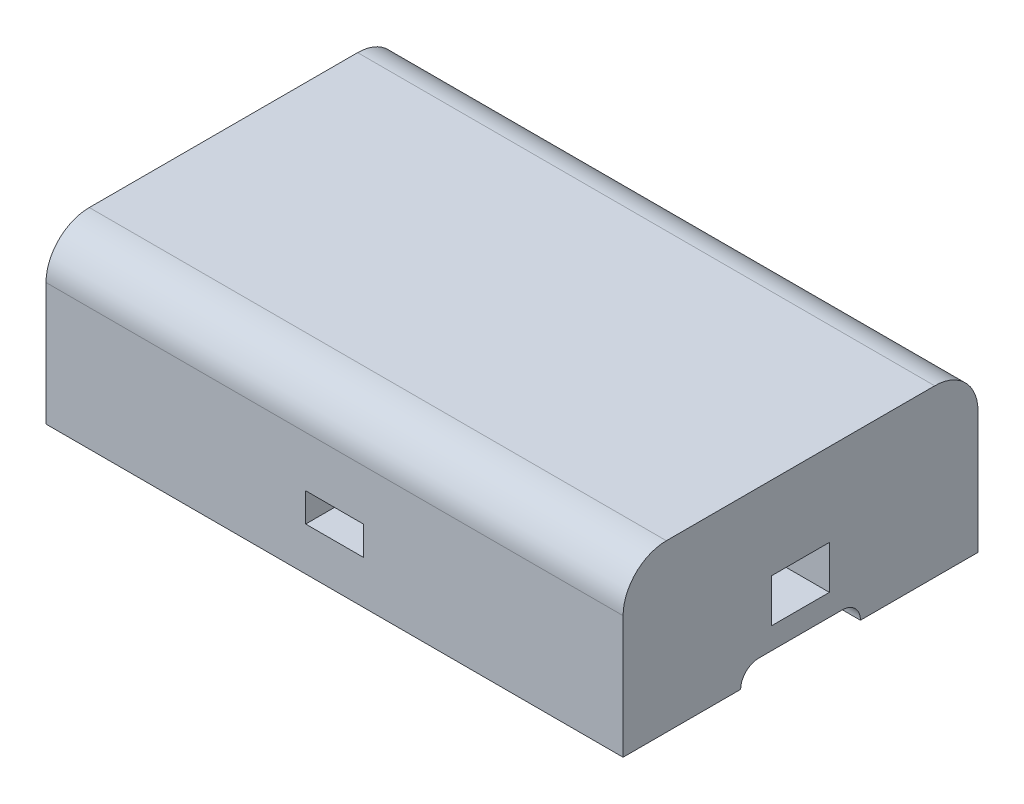
ISO-10303-21;
HEADER;
FILE_DESCRIPTION(('STEP AP214'),'2;1');
FILE_NAME('part.step','',(''),(''),'','','');
FILE_SCHEMA(('AUTOMOTIVE_DESIGN { 1 0 10303 214 1 1 1 1 }'));
ENDSEC;
DATA;
#1=APPLICATION_CONTEXT('core data for automotive mechanical design processes');
#2=APPLICATION_PROTOCOL_DEFINITION('international standard','automotive_design',2000,#1);
#3=PRODUCT_CONTEXT('',#1,'mechanical');
#4=PRODUCT('Part','Part','',(#3));
#5=PRODUCT_RELATED_PRODUCT_CATEGORY('part','',(#4));
#6=PRODUCT_DEFINITION_FORMATION('','',#4);
#7=PRODUCT_DEFINITION_CONTEXT('part definition',#1,'design');
#8=PRODUCT_DEFINITION('design','',#6,#7);
#9=PRODUCT_DEFINITION_SHAPE('','',#8);
#10=(LENGTH_UNIT() NAMED_UNIT(*) SI_UNIT(.MILLI.,.METRE.));
#11=(NAMED_UNIT(*) PLANE_ANGLE_UNIT() SI_UNIT($,.RADIAN.));
#12=(NAMED_UNIT(*) SI_UNIT($,.STERADIAN.) SOLID_ANGLE_UNIT());
#13=UNCERTAINTY_MEASURE_WITH_UNIT(LENGTH_MEASURE(1.E-05),#10,'distance_accuracy_value','');
#14=(GEOMETRIC_REPRESENTATION_CONTEXT(3) GLOBAL_UNCERTAINTY_ASSIGNED_CONTEXT((#13)) GLOBAL_UNIT_ASSIGNED_CONTEXT((#10,
#11,#12)) REPRESENTATION_CONTEXT('',''));
#15=CARTESIAN_POINT('',(0.,0.,0.));
#16=DIRECTION('',(0.,0.,1.));
#17=DIRECTION('',(1.,0.,0.));
#18=AXIS2_PLACEMENT_3D('',#15,#16,#17);
#19=CARTESIAN_POINT('',(-20.,14.,12.3));
#20=DIRECTION('',(0.,0.,-1.));
#21=DIRECTION('',(-1.,0.,0.));
#22=AXIS2_PLACEMENT_3D('',#19,#20,#21);
#23=PLANE('',#22);
#24=DIRECTION('',(0.,-1.,0.));
#25=VECTOR('',#24,1.);
#26=CARTESIAN_POINT('',(-20.,14.,12.3));
#27=LINE('',#26,#25);
#28=CARTESIAN_POINT('',(-20.,14.,12.3));
#29=VERTEX_POINT('',#28);
#30=CARTESIAN_POINT('',(-20.,5.5,12.3));
#31=VERTEX_POINT('',#30);
#32=EDGE_CURVE('E489',#29,#31,#27,.T.);
#33=ORIENTED_EDGE('',*,*,#32,.T.);
#34=DIRECTION('',(-1.,0.,0.));
#35=VECTOR('',#34,1.);
#36=CARTESIAN_POINT('',(-20.,5.5,12.3));
#37=LINE('',#36,#35);
#38=CARTESIAN_POINT('',(20.,5.5,12.3));
#39=VERTEX_POINT('',#38);
#40=EDGE_CURVE('E476',#39,#31,#37,.T.);
#41=ORIENTED_EDGE('',*,*,#40,.F.);
#42=DIRECTION('',(0.,-1.,0.));
#43=VECTOR('',#42,1.);
#44=CARTESIAN_POINT('',(20.,14.,12.3));
#45=LINE('',#44,#43);
#46=CARTESIAN_POINT('',(20.,14.,12.3));
#47=VERTEX_POINT('',#46);
#48=EDGE_CURVE('E426',#47,#39,#45,.T.);
#49=ORIENTED_EDGE('',*,*,#48,.F.);
#50=DIRECTION('',(1.,0.,0.));
#51=VECTOR('',#50,1.);
#52=CARTESIAN_POINT('',(-20.,14.,12.3));
#53=LINE('',#52,#51);
#54=EDGE_CURVE('E422',#29,#47,#53,.T.);
#55=ORIENTED_EDGE('',*,*,#54,.F.);
#56=EDGE_LOOP('',(#33,#41,#49,#55));
#57=FACE_BOUND('',#56,.T.);
#58=DIRECTION('',(-1.,0.,0.));
#59=VECTOR('',#58,1.);
#60=CARTESIAN_POINT('',(2.,8.5,12.3));
#61=LINE('',#60,#59);
#62=CARTESIAN_POINT('',(2.,8.5,12.3));
#63=VERTEX_POINT('',#62);
#64=CARTESIAN_POINT('',(-2.,8.5,12.3));
#65=VERTEX_POINT('',#64);
#66=EDGE_CURVE('E359',#63,#65,#61,.T.);
#67=ORIENTED_EDGE('',*,*,#66,.T.);
#68=DIRECTION('',(0.,-1.,0.));
#69=VECTOR('',#68,1.);
#70=CARTESIAN_POINT('',(-2.,14.,12.3));
#71=LINE('',#70,#69);
#72=CARTESIAN_POINT('',(-2.,10.5,12.3));
#73=VERTEX_POINT('',#72);
#74=EDGE_CURVE('E11',#73,#65,#71,.T.);
#75=ORIENTED_EDGE('',*,*,#74,.F.);
#76=DIRECTION('',(-1.,0.,0.));
#77=VECTOR('',#76,1.);
#78=CARTESIAN_POINT('',(-20.,10.5,12.3));
#79=LINE('',#78,#77);
#80=CARTESIAN_POINT('',(2.,10.5,12.3));
#81=VERTEX_POINT('',#80);
#82=EDGE_CURVE('E514',#81,#73,#79,.T.);
#83=ORIENTED_EDGE('',*,*,#82,.F.);
#84=DIRECTION('',(0.,1.,0.));
#85=VECTOR('',#84,1.);
#86=CARTESIAN_POINT('',(2.,14.,12.3));
#87=LINE('',#86,#85);
#88=EDGE_CURVE('E46',#63,#81,#87,.T.);
#89=ORIENTED_EDGE('',*,*,#88,.F.);
#90=EDGE_LOOP('',(#67,#75,#83,#89));
#91=FACE_BOUND('',#90,.T.);
#92=ADVANCED_FACE('F39',(#57,#91),#23,.F.);
#93=CARTESIAN_POINT('',(0.,5.5,0.));
#94=DIRECTION('',(0.,-1.,0.));
#95=DIRECTION('',(0.,0.,-1.));
#96=AXIS2_PLACEMENT_3D('',#93,#94,#95);
#97=PLANE('',#96);
#98=DIRECTION('',(0.,0.,-1.));
#99=VECTOR('',#98,1.);
#100=CARTESIAN_POINT('',(13.,5.5,-11.3));
#101=LINE('',#100,#99);
#102=CARTESIAN_POINT('',(13.,5.5,-11.3));
#103=VERTEX_POINT('',#102);
#104=CARTESIAN_POINT('',(13.,5.5,-12.3));
#105=VERTEX_POINT('',#104);
#106=EDGE_CURVE('E351',#103,#105,#101,.T.);
#107=ORIENTED_EDGE('',*,*,#106,.T.);
#108=DIRECTION('',(1.,0.,0.));
#109=VECTOR('',#108,1.);
#110=CARTESIAN_POINT('',(-20.,5.5,-12.3));
#111=LINE('',#110,#109);
#112=CARTESIAN_POINT('',(20.,5.5,-12.3));
#113=VERTEX_POINT('',#112);
#114=EDGE_CURVE('E472',#105,#113,#111,.T.);
#115=ORIENTED_EDGE('',*,*,#114,.T.);
#116=DIRECTION('',(0.,0.,1.));
#117=VECTOR('',#116,1.);
#118=CARTESIAN_POINT('',(20.,5.5,-12.3));
#119=LINE('',#118,#117);
#120=CARTESIAN_POINT('',(20.,5.5,-4.15));
#121=VERTEX_POINT('',#120);
#122=EDGE_CURVE('E464',#113,#121,#119,.T.);
#123=ORIENTED_EDGE('',*,*,#122,.T.);
#124=DIRECTION('',(1.,0.,0.));
#125=VECTOR('',#124,1.);
#126=CARTESIAN_POINT('',(10.,5.5,-4.15));
#127=LINE('',#126,#125);
#128=CARTESIAN_POINT('',(17.,5.5,-4.15));
#129=VERTEX_POINT('',#128);
#130=EDGE_CURVE('E478',#121,#129,#127,.F.);
#131=ORIENTED_EDGE('',*,*,#130,.T.);
#132=DIRECTION('',(0.,0.,1.));
#133=VECTOR('',#132,1.);
#134=CARTESIAN_POINT('',(17.,5.5,-9.3));
#135=LINE('',#134,#133);
#136=CARTESIAN_POINT('',(17.,5.5,-9.3));
#137=VERTEX_POINT('',#136);
#138=EDGE_CURVE('E461',#137,#129,#135,.T.);
#139=ORIENTED_EDGE('',*,*,#138,.F.);
#140=DIRECTION('',(1.,0.,0.));
#141=VECTOR('',#140,1.);
#142=CARTESIAN_POINT('',(-17.,5.5,-9.3));
#143=LINE('',#142,#141);
#144=CARTESIAN_POINT('',(-17.,5.5,-9.3));
#145=VERTEX_POINT('',#144);
#146=EDGE_CURVE('E458',#145,#137,#143,.T.);
#147=ORIENTED_EDGE('',*,*,#146,.F.);
#148=DIRECTION('',(0.,0.,-1.));
#149=VECTOR('',#148,1.);
#150=CARTESIAN_POINT('',(-17.,5.5,-9.3));
#151=LINE('',#150,#149);
#152=CARTESIAN_POINT('',(-17.,5.5,9.3));
#153=VERTEX_POINT('',#152);
#154=EDGE_CURVE('E456',#153,#145,#151,.T.);
#155=ORIENTED_EDGE('',*,*,#154,.F.);
#156=DIRECTION('',(-1.,0.,0.));
#157=VECTOR('',#156,1.);
#158=CARTESIAN_POINT('',(-17.,5.5,9.3));
#159=LINE('',#158,#157);
#160=CARTESIAN_POINT('',(17.,5.5,9.3));
#161=VERTEX_POINT('',#160);
#162=EDGE_CURVE('E453',#161,#153,#159,.T.);
#163=ORIENTED_EDGE('',*,*,#162,.F.);
#164=CARTESIAN_POINT('',(17.,5.5,4.15));
#165=VERTEX_POINT('',#164);
#166=EDGE_CURVE('E460',#165,#161,#135,.T.);
#167=ORIENTED_EDGE('',*,*,#166,.F.);
#168=DIRECTION('',(1.,0.,0.));
#169=VECTOR('',#168,1.);
#170=CARTESIAN_POINT('',(10.,5.5,4.15));
#171=LINE('',#170,#169);
#172=CARTESIAN_POINT('',(20.,5.5,4.15));
#173=VERTEX_POINT('',#172);
#174=EDGE_CURVE('E410',#165,#173,#171,.T.);
#175=ORIENTED_EDGE('',*,*,#174,.T.);
#176=EDGE_CURVE('E465',#173,#39,#119,.T.);
#177=ORIENTED_EDGE('',*,*,#176,.T.);
#178=ORIENTED_EDGE('',*,*,#40,.T.);
#179=DIRECTION('',(0.,0.,-1.));
#180=VECTOR('',#179,1.);
#181=CARTESIAN_POINT('',(-20.,5.5,-12.3));
#182=LINE('',#181,#180);
#183=CARTESIAN_POINT('',(-20.,5.5,-12.3));
#184=VERTEX_POINT('',#183);
#185=EDGE_CURVE('E473',#31,#184,#182,.T.);
#186=ORIENTED_EDGE('',*,*,#185,.T.);
#187=CARTESIAN_POINT('',(-13.,5.5,-12.3));
#188=VERTEX_POINT('',#187);
#189=EDGE_CURVE('E468',#184,#188,#111,.T.);
#190=ORIENTED_EDGE('',*,*,#189,.T.);
#191=DIRECTION('',(0.,0.,-1.));
#192=VECTOR('',#191,1.);
#193=CARTESIAN_POINT('',(-13.,5.5,-11.3));
#194=LINE('',#193,#192);
#195=CARTESIAN_POINT('',(-13.,5.5,-11.3));
#196=VERTEX_POINT('',#195);
#197=EDGE_CURVE('E327',#196,#188,#194,.T.);
#198=ORIENTED_EDGE('',*,*,#197,.F.);
#199=DIRECTION('',(-1.,0.,0.));
#200=VECTOR('',#199,1.);
#201=CARTESIAN_POINT('',(-13.,5.5,-11.3));
#202=LINE('',#201,#200);
#203=CARTESIAN_POINT('',(-11.,5.5,-11.3));
#204=VERTEX_POINT('',#203);
#205=EDGE_CURVE('E318',#204,#196,#202,.T.);
#206=ORIENTED_EDGE('',*,*,#205,.F.);
#207=DIRECTION('',(0.,0.,-1.));
#208=VECTOR('',#207,1.);
#209=CARTESIAN_POINT('',(-11.,5.5,-11.3));
#210=LINE('',#209,#208);
#211=CARTESIAN_POINT('',(-11.,5.5,-12.3));
#212=VERTEX_POINT('',#211);
#213=EDGE_CURVE('E333',#204,#212,#210,.T.);
#214=ORIENTED_EDGE('',*,*,#213,.T.);
#215=CARTESIAN_POINT('',(11.,5.5,-12.3));
#216=VERTEX_POINT('',#215);
#217=EDGE_CURVE('E471',#212,#216,#111,.T.);
#218=ORIENTED_EDGE('',*,*,#217,.T.);
#219=DIRECTION('',(0.,0.,-1.));
#220=VECTOR('',#219,1.);
#221=CARTESIAN_POINT('',(11.,5.5,-11.3));
#222=LINE('',#221,#220);
#223=CARTESIAN_POINT('',(11.,5.5,-11.3));
#224=VERTEX_POINT('',#223);
#225=EDGE_CURVE('E363',#224,#216,#222,.T.);
#226=ORIENTED_EDGE('',*,*,#225,.F.);
#227=DIRECTION('',(-1.,0.,0.));
#228=VECTOR('',#227,1.);
#229=CARTESIAN_POINT('',(13.,5.5,-11.3));
#230=LINE('',#229,#228);
#231=EDGE_CURVE('E344',#103,#224,#230,.T.);
#232=ORIENTED_EDGE('',*,*,#231,.F.);
#233=EDGE_LOOP('',(#107,#115,#123,#131,#139,#147,#155,#163,#167,#175,#177,#178,#186,#190,#198,
#206,#214,#218,#226,#232));
#234=FACE_BOUND('',#233,.T.);
#235=ADVANCED_FACE('F551',(#234),#97,.T.);
#236=CARTESIAN_POINT('',(20.,14.,-12.3));
#237=DIRECTION('',(-1.,0.,0.));
#238=DIRECTION('',(0.,0.,1.));
#239=AXIS2_PLACEMENT_3D('',#236,#237,#238);
#240=PLANE('',#239);
#241=DIRECTION('',(0.,0.,1.));
#242=VECTOR('',#241,1.);
#243=CARTESIAN_POINT('',(20.,11.25,2.));
#244=LINE('',#243,#242);
#245=CARTESIAN_POINT('',(20.,11.25,-2.));
#246=VERTEX_POINT('',#245);
#247=CARTESIAN_POINT('',(20.,11.25,2.));
#248=VERTEX_POINT('',#247);
#249=EDGE_CURVE('E398',#246,#248,#244,.T.);
#250=ORIENTED_EDGE('',*,*,#249,.F.);
#251=DIRECTION('',(0.,1.,0.));
#252=VECTOR('',#251,1.);
#253=CARTESIAN_POINT('',(20.,11.25,-2.));
#254=LINE('',#253,#252);
#255=CARTESIAN_POINT('',(20.,8.25,-2.));
#256=VERTEX_POINT('',#255);
#257=EDGE_CURVE('E396',#256,#246,#254,.T.);
#258=ORIENTED_EDGE('',*,*,#257,.F.);
#259=DIRECTION('',(0.,0.,-1.));
#260=VECTOR('',#259,1.);
#261=CARTESIAN_POINT('',(20.,8.25,2.));
#262=LINE('',#261,#260);
#263=CARTESIAN_POINT('',(20.,8.25,2.));
#264=VERTEX_POINT('',#263);
#265=EDGE_CURVE('E404',#264,#256,#262,.T.);
#266=ORIENTED_EDGE('',*,*,#265,.F.);
#267=DIRECTION('',(0.,-1.,0.));
#268=VECTOR('',#267,1.);
#269=CARTESIAN_POINT('',(20.,11.25,2.));
#270=LINE('',#269,#268);
#271=EDGE_CURVE('E401',#248,#264,#270,.T.);
#272=ORIENTED_EDGE('',*,*,#271,.F.);
#273=EDGE_LOOP('',(#250,#258,#266,#272));
#274=FACE_BOUND('',#273,.T.);
#275=ORIENTED_EDGE('',*,*,#122,.F.);
#276=DIRECTION('',(0.,-1.,0.));
#277=VECTOR('',#276,1.);
#278=CARTESIAN_POINT('',(20.,14.,-12.3));
#279=LINE('',#278,#277);
#280=CARTESIAN_POINT('',(20.,14.,-12.3));
#281=VERTEX_POINT('',#280);
#282=EDGE_CURVE('E420',#281,#113,#279,.T.);
#283=ORIENTED_EDGE('',*,*,#282,.F.);
#284=CARTESIAN_POINT('',(20.,14.,-9.3));
#285=DIRECTION('',(1.,0.,0.));
#286=DIRECTION('',(0.,0.,-1.));
#287=AXIS2_PLACEMENT_3D('',#284,#285,#286);
#288=CIRCLE('',#287,3.);
#289=CARTESIAN_POINT('',(20.,17.,-9.3));
#290=VERTEX_POINT('',#289);
#291=EDGE_CURVE('E379',#281,#290,#288,.T.);
#292=ORIENTED_EDGE('',*,*,#291,.T.);
#293=DIRECTION('',(0.,0.,-1.));
#294=VECTOR('',#293,1.);
#295=CARTESIAN_POINT('',(20.,17.,9.3));
#296=LINE('',#295,#294);
#297=CARTESIAN_POINT('',(20.,17.,9.3));
#298=VERTEX_POINT('',#297);
#299=EDGE_CURVE('E387',#298,#290,#296,.T.);
#300=ORIENTED_EDGE('',*,*,#299,.F.);
#301=CARTESIAN_POINT('',(20.,14.,9.3));
#302=DIRECTION('',(-1.,0.,0.));
#303=DIRECTION('',(0.,0.,1.));
#304=AXIS2_PLACEMENT_3D('',#301,#302,#303);
#305=CIRCLE('',#304,3.);
#306=EDGE_CURVE('E374',#47,#298,#305,.T.);
#307=ORIENTED_EDGE('',*,*,#306,.F.);
#308=ORIENTED_EDGE('',*,*,#48,.T.);
#309=ORIENTED_EDGE('',*,*,#176,.F.);
#310=CARTESIAN_POINT('',(20.,5.5,2.9));
#311=DIRECTION('',(1.,0.,0.));
#312=DIRECTION('',(0.,0.,-1.));
#313=AXIS2_PLACEMENT_3D('',#310,#311,#312);
#314=CIRCLE('',#313,1.25);
#315=CARTESIAN_POINT('',(20.,6.75,2.9));
#316=VERTEX_POINT('',#315);
#317=EDGE_CURVE('E447',#316,#173,#314,.T.);
#318=ORIENTED_EDGE('',*,*,#317,.F.);
#319=DIRECTION('',(0.,0.,-1.));
#320=VECTOR('',#319,1.);
#321=CARTESIAN_POINT('',(20.,6.75,0.));
#322=LINE('',#321,#320);
#323=CARTESIAN_POINT('',(20.,6.75,-2.9));
#324=VERTEX_POINT('',#323);
#325=EDGE_CURVE('E449',#316,#324,#322,.T.);
#326=ORIENTED_EDGE('',*,*,#325,.T.);
#327=CARTESIAN_POINT('',(20.,5.5,-2.9));
#328=DIRECTION('',(1.,0.,0.));
#329=DIRECTION('',(0.,0.,-1.));
#330=AXIS2_PLACEMENT_3D('',#327,#328,#329);
#331=CIRCLE('',#330,1.25);
#332=EDGE_CURVE('E452',#121,#324,#331,.T.);
#333=ORIENTED_EDGE('',*,*,#332,.F.);
#334=EDGE_LOOP('',(#275,#283,#292,#300,#307,#308,#309,#318,#326,#333));
#335=FACE_BOUND('',#334,.T.);
#336=ADVANCED_FACE('F553',(#274,#335),#240,.F.);
#337=CARTESIAN_POINT('',(-20.,14.,-12.3));
#338=DIRECTION('',(0.,0.,1.));
#339=DIRECTION('',(1.,0.,0.));
#340=AXIS2_PLACEMENT_3D('',#337,#338,#339);
#341=PLANE('',#340);
#342=ORIENTED_EDGE('',*,*,#114,.F.);
#343=DIRECTION('',(0.,-1.,0.));
#344=VECTOR('',#343,1.);
#345=CARTESIAN_POINT('',(13.,5.5,-12.3));
#346=LINE('',#345,#344);
#347=CARTESIAN_POINT('',(13.,8.5,-12.3));
#348=VERTEX_POINT('',#347);
#349=EDGE_CURVE('E336',#348,#105,#346,.T.);
#350=ORIENTED_EDGE('',*,*,#349,.F.);
#351=DIRECTION('',(1.,0.,0.));
#352=VECTOR('',#351,1.);
#353=CARTESIAN_POINT('',(13.,8.5,-12.3));
#354=LINE('',#353,#352);
#355=CARTESIAN_POINT('',(11.,8.5,-12.3));
#356=VERTEX_POINT('',#355);
#357=EDGE_CURVE('E345',#356,#348,#354,.T.);
#358=ORIENTED_EDGE('',*,*,#357,.F.);
#359=DIRECTION('',(0.,1.,0.));
#360=VECTOR('',#359,1.);
#361=CARTESIAN_POINT('',(11.,5.5,-12.3));
#362=LINE('',#361,#360);
#363=EDGE_CURVE('E353',#216,#356,#362,.T.);
#364=ORIENTED_EDGE('',*,*,#363,.F.);
#365=ORIENTED_EDGE('',*,*,#217,.F.);
#366=DIRECTION('',(0.,-1.,0.));
#367=VECTOR('',#366,1.);
#368=CARTESIAN_POINT('',(-11.,5.5,-12.3));
#369=LINE('',#368,#367);
#370=CARTESIAN_POINT('',(-11.,8.5,-12.3));
#371=VERTEX_POINT('',#370);
#372=EDGE_CURVE('E322',#371,#212,#369,.T.);
#373=ORIENTED_EDGE('',*,*,#372,.F.);
#374=DIRECTION('',(1.,0.,0.));
#375=VECTOR('',#374,1.);
#376=CARTESIAN_POINT('',(-13.,8.5,-12.3));
#377=LINE('',#376,#375);
#378=CARTESIAN_POINT('',(-13.,8.5,-12.3));
#379=VERTEX_POINT('',#378);
#380=EDGE_CURVE('E329',#379,#371,#377,.T.);
#381=ORIENTED_EDGE('',*,*,#380,.F.);
#382=DIRECTION('',(0.,1.,0.));
#383=VECTOR('',#382,1.);
#384=CARTESIAN_POINT('',(-13.,5.5,-12.3));
#385=LINE('',#384,#383);
#386=EDGE_CURVE('E317',#188,#379,#385,.T.);
#387=ORIENTED_EDGE('',*,*,#386,.F.);
#388=ORIENTED_EDGE('',*,*,#189,.F.);
#389=DIRECTION('',(0.,-1.,0.));
#390=VECTOR('',#389,1.);
#391=CARTESIAN_POINT('',(-20.,14.,-12.3));
#392=LINE('',#391,#390);
#393=CARTESIAN_POINT('',(-20.,14.,-12.3));
#394=VERTEX_POINT('',#393);
#395=EDGE_CURVE('E487',#394,#184,#392,.T.);
#396=ORIENTED_EDGE('',*,*,#395,.F.);
#397=DIRECTION('',(-1.,0.,0.));
#398=VECTOR('',#397,1.);
#399=CARTESIAN_POINT('',(-20.,14.,-12.3));
#400=LINE('',#399,#398);
#401=EDGE_CURVE('E425',#281,#394,#400,.T.);
#402=ORIENTED_EDGE('',*,*,#401,.F.);
#403=ORIENTED_EDGE('',*,*,#282,.T.);
#404=EDGE_LOOP('',(#342,#350,#358,#364,#365,#373,#381,#387,#388,#396,#402,#403));
#405=FACE_BOUND('',#404,.T.);
#406=ADVANCED_FACE('F564',(#405),#341,.F.);
#407=CARTESIAN_POINT('',(-20.,14.,-12.3));
#408=DIRECTION('',(1.,0.,0.));
#409=DIRECTION('',(0.,0.,-1.));
#410=AXIS2_PLACEMENT_3D('',#407,#408,#409);
#411=PLANE('',#410);
#412=ORIENTED_EDGE('',*,*,#185,.F.);
#413=ORIENTED_EDGE('',*,*,#32,.F.);
#414=CARTESIAN_POINT('',(-20.,14.,9.3));
#415=DIRECTION('',(-1.,0.,0.));
#416=DIRECTION('',(0.,0.,1.));
#417=AXIS2_PLACEMENT_3D('',#414,#415,#416);
#418=CIRCLE('',#417,3.);
#419=CARTESIAN_POINT('',(-20.,17.,9.3));
#420=VERTEX_POINT('',#419);
#421=EDGE_CURVE('E375',#29,#420,#418,.T.);
#422=ORIENTED_EDGE('',*,*,#421,.T.);
#423=DIRECTION('',(0.,0.,-1.));
#424=VECTOR('',#423,1.);
#425=CARTESIAN_POINT('',(-20.,17.,9.3));
#426=LINE('',#425,#424);
#427=CARTESIAN_POINT('',(-20.,17.,-9.3));
#428=VERTEX_POINT('',#427);
#429=EDGE_CURVE('E378',#420,#428,#426,.T.);
#430=ORIENTED_EDGE('',*,*,#429,.T.);
#431=CARTESIAN_POINT('',(-20.,14.,-9.3));
#432=DIRECTION('',(1.,0.,0.));
#433=DIRECTION('',(0.,0.,-1.));
#434=AXIS2_PLACEMENT_3D('',#431,#432,#433);
#435=CIRCLE('',#434,3.);
#436=EDGE_CURVE('E381',#394,#428,#435,.T.);
#437=ORIENTED_EDGE('',*,*,#436,.F.);
#438=ORIENTED_EDGE('',*,*,#395,.T.);
#439=EDGE_LOOP('',(#412,#413,#422,#430,#437,#438));
#440=FACE_BOUND('',#439,.T.);
#441=ADVANCED_FACE('F572',(#440),#411,.F.);
#442=CARTESIAN_POINT('',(17.,14.,-9.3));
#443=DIRECTION('',(-1.,0.,0.));
#444=DIRECTION('',(0.,0.,1.));
#445=AXIS2_PLACEMENT_3D('',#442,#443,#444);
#446=PLANE('',#445);
#447=DIRECTION('',(0.,-1.,0.));
#448=VECTOR('',#447,1.);
#449=CARTESIAN_POINT('',(17.,14.,-2.));
#450=LINE('',#449,#448);
#451=CARTESIAN_POINT('',(17.,11.25,-2.));
#452=VERTEX_POINT('',#451);
#453=CARTESIAN_POINT('',(17.,8.25,-2.));
#454=VERTEX_POINT('',#453);
#455=EDGE_CURVE('E512',#452,#454,#450,.T.);
#456=ORIENTED_EDGE('',*,*,#455,.F.);
#457=DIRECTION('',(0.,0.,-1.));
#458=VECTOR('',#457,1.);
#459=CARTESIAN_POINT('',(17.,11.25,-9.3));
#460=LINE('',#459,#458);
#461=CARTESIAN_POINT('',(17.,11.25,2.));
#462=VERTEX_POINT('',#461);
#463=EDGE_CURVE('E505',#462,#452,#460,.T.);
#464=ORIENTED_EDGE('',*,*,#463,.F.);
#465=DIRECTION('',(0.,1.,0.));
#466=VECTOR('',#465,1.);
#467=CARTESIAN_POINT('',(17.,14.,2.));
#468=LINE('',#467,#466);
#469=CARTESIAN_POINT('',(17.,8.25,2.));
#470=VERTEX_POINT('',#469);
#471=EDGE_CURVE('E507',#470,#462,#468,.T.);
#472=ORIENTED_EDGE('',*,*,#471,.F.);
#473=DIRECTION('',(0.,0.,1.));
#474=VECTOR('',#473,1.);
#475=CARTESIAN_POINT('',(17.,8.25,-9.3));
#476=LINE('',#475,#474);
#477=EDGE_CURVE('E510',#454,#470,#476,.T.);
#478=ORIENTED_EDGE('',*,*,#477,.F.);
#479=EDGE_LOOP('',(#456,#464,#472,#478));
#480=FACE_BOUND('',#479,.T.);
#481=DIRECTION('',(0.,-1.,0.));
#482=VECTOR('',#481,1.);
#483=CARTESIAN_POINT('',(17.,14.,-9.3));
#484=LINE('',#483,#482);
#485=CARTESIAN_POINT('',(17.,14.,-9.3));
#486=VERTEX_POINT('',#485);
#487=EDGE_CURVE('E429',#486,#137,#484,.T.);
#488=ORIENTED_EDGE('',*,*,#487,.T.);
#489=ORIENTED_EDGE('',*,*,#138,.T.);
#490=CARTESIAN_POINT('',(17.,5.5,-2.9));
#491=DIRECTION('',(-1.,0.,0.));
#492=DIRECTION('',(0.,0.,1.));
#493=AXIS2_PLACEMENT_3D('',#490,#491,#492);
#494=CIRCLE('',#493,1.25);
#495=CARTESIAN_POINT('',(17.,6.75,-2.9));
#496=VERTEX_POINT('',#495);
#497=EDGE_CURVE('E455',#496,#129,#494,.T.);
#498=ORIENTED_EDGE('',*,*,#497,.F.);
#499=DIRECTION('',(0.,0.,1.));
#500=VECTOR('',#499,1.);
#501=CARTESIAN_POINT('',(17.,6.75,-9.3));
#502=LINE('',#501,#500);
#503=CARTESIAN_POINT('',(17.,6.75,2.9));
#504=VERTEX_POINT('',#503);
#505=EDGE_CURVE('E417',#496,#504,#502,.T.);
#506=ORIENTED_EDGE('',*,*,#505,.T.);
#507=CARTESIAN_POINT('',(17.,5.5,2.9));
#508=DIRECTION('',(-1.,0.,0.));
#509=DIRECTION('',(0.,0.,1.));
#510=AXIS2_PLACEMENT_3D('',#507,#508,#509);
#511=CIRCLE('',#510,1.25);
#512=EDGE_CURVE('E421',#165,#504,#511,.T.);
#513=ORIENTED_EDGE('',*,*,#512,.F.);
#514=ORIENTED_EDGE('',*,*,#166,.T.);
#515=DIRECTION('',(0.,-1.,0.));
#516=VECTOR('',#515,1.);
#517=CARTESIAN_POINT('',(17.,14.,9.3));
#518=LINE('',#517,#516);
#519=CARTESIAN_POINT('',(17.,14.,9.3));
#520=VERTEX_POINT('',#519);
#521=EDGE_CURVE('E434',#520,#161,#518,.T.);
#522=ORIENTED_EDGE('',*,*,#521,.F.);
#523=DIRECTION('',(0.,0.,-1.));
#524=VECTOR('',#523,1.);
#525=CARTESIAN_POINT('',(17.,14.,-9.3));
#526=LINE('',#525,#524);
#527=EDGE_CURVE('E440',#520,#486,#526,.T.);
#528=ORIENTED_EDGE('',*,*,#527,.T.);
#529=EDGE_LOOP('',(#488,#489,#498,#506,#513,#514,#522,#528));
#530=FACE_BOUND('',#529,.T.);
#531=ADVANCED_FACE('F581',(#480,#530),#446,.T.);
#532=CARTESIAN_POINT('',(-17.,14.,-9.3));
#533=DIRECTION('',(0.,0.,1.));
#534=DIRECTION('',(1.,0.,0.));
#535=AXIS2_PLACEMENT_3D('',#532,#533,#534);
#536=PLANE('',#535);
#537=DIRECTION('',(0.,1.,0.));
#538=VECTOR('',#537,1.);
#539=CARTESIAN_POINT('',(13.,14.,-9.3));
#540=LINE('',#539,#538);
#541=CARTESIAN_POINT('',(13.,7.,-9.3));
#542=VERTEX_POINT('',#541);
#543=CARTESIAN_POINT('',(13.,8.5,-9.3));
#544=VERTEX_POINT('',#543);
#545=EDGE_CURVE('E263',#542,#544,#540,.T.);
#546=ORIENTED_EDGE('',*,*,#545,.F.);
#547=DIRECTION('',(1.,0.,0.));
#548=VECTOR('',#547,1.);
#549=CARTESIAN_POINT('',(-17.,7.,-9.3));
#550=LINE('',#549,#548);
#551=CARTESIAN_POINT('',(11.,7.,-9.3));
#552=VERTEX_POINT('',#551);
#553=EDGE_CURVE('E271',#552,#542,#550,.T.);
#554=ORIENTED_EDGE('',*,*,#553,.F.);
#555=DIRECTION('',(0.,-1.,0.));
#556=VECTOR('',#555,1.);
#557=CARTESIAN_POINT('',(11.,14.,-9.3));
#558=LINE('',#557,#556);
#559=CARTESIAN_POINT('',(11.,8.5,-9.3));
#560=VERTEX_POINT('',#559);
#561=EDGE_CURVE('E275',#560,#552,#558,.T.);
#562=ORIENTED_EDGE('',*,*,#561,.F.);
#563=DIRECTION('',(-1.,0.,0.));
#564=VECTOR('',#563,1.);
#565=CARTESIAN_POINT('',(-17.,8.5,-9.3));
#566=LINE('',#565,#564);
#567=EDGE_CURVE('E280',#544,#560,#566,.T.);
#568=ORIENTED_EDGE('',*,*,#567,.F.);
#569=EDGE_LOOP('',(#546,#554,#562,#568));
#570=FACE_BOUND('',#569,.T.);
#571=DIRECTION('',(0.,1.,0.));
#572=VECTOR('',#571,1.);
#573=CARTESIAN_POINT('',(-11.,14.,-9.3));
#574=LINE('',#573,#572);
#575=CARTESIAN_POINT('',(-11.,7.,-9.3));
#576=VERTEX_POINT('',#575);
#577=CARTESIAN_POINT('',(-11.,8.49999999999997,-9.3));
#578=VERTEX_POINT('',#577);
#579=EDGE_CURVE('E292',#576,#578,#574,.T.);
#580=ORIENTED_EDGE('',*,*,#579,.F.);
#581=DIRECTION('',(1.,0.,0.));
#582=VECTOR('',#581,1.);
#583=CARTESIAN_POINT('',(-17.,7.,-9.3));
#584=LINE('',#583,#582);
#585=CARTESIAN_POINT('',(-13.,7.,-9.3));
#586=VERTEX_POINT('',#585);
#587=EDGE_CURVE('E281',#586,#576,#584,.T.);
#588=ORIENTED_EDGE('',*,*,#587,.F.);
#589=DIRECTION('',(0.,-1.,0.));
#590=VECTOR('',#589,1.);
#591=CARTESIAN_POINT('',(-13.,14.,-9.3));
#592=LINE('',#591,#590);
#593=CARTESIAN_POINT('',(-13.,8.49999999999997,-9.3));
#594=VERTEX_POINT('',#593);
#595=EDGE_CURVE('E290',#594,#586,#592,.T.);
#596=ORIENTED_EDGE('',*,*,#595,.F.);
#597=DIRECTION('',(-1.,0.,0.));
#598=VECTOR('',#597,1.);
#599=CARTESIAN_POINT('',(-17.,8.49999999999997,-9.3));
#600=LINE('',#599,#598);
#601=EDGE_CURVE('E283',#578,#594,#600,.T.);
#602=ORIENTED_EDGE('',*,*,#601,.F.);
#603=EDGE_LOOP('',(#580,#588,#596,#602));
#604=FACE_BOUND('',#603,.T.);
#605=DIRECTION('',(0.,-1.,0.));
#606=VECTOR('',#605,1.);
#607=CARTESIAN_POINT('',(-17.,14.,-9.3));
#608=LINE('',#607,#606);
#609=CARTESIAN_POINT('',(-17.,14.,-9.3));
#610=VERTEX_POINT('',#609);
#611=EDGE_CURVE('E495',#610,#145,#608,.T.);
#612=ORIENTED_EDGE('',*,*,#611,.T.);
#613=ORIENTED_EDGE('',*,*,#146,.T.);
#614=ORIENTED_EDGE('',*,*,#487,.F.);
#615=DIRECTION('',(-1.,0.,0.));
#616=VECTOR('',#615,1.);
#617=CARTESIAN_POINT('',(-17.,14.,-9.3));
#618=LINE('',#617,#616);
#619=EDGE_CURVE('E437',#486,#610,#618,.T.);
#620=ORIENTED_EDGE('',*,*,#619,.T.);
#621=EDGE_LOOP('',(#612,#613,#614,#620));
#622=FACE_BOUND('',#621,.T.);
#623=ADVANCED_FACE('F277',(#570,#604,#622),#536,.T.);
#624=CARTESIAN_POINT('',(-17.,14.,-9.3));
#625=DIRECTION('',(1.,0.,0.));
#626=DIRECTION('',(0.,0.,-1.));
#627=AXIS2_PLACEMENT_3D('',#624,#625,#626);
#628=PLANE('',#627);
#629=DIRECTION('',(0.,-1.,0.));
#630=VECTOR('',#629,1.);
#631=CARTESIAN_POINT('',(-17.,14.,9.3));
#632=LINE('',#631,#630);
#633=CARTESIAN_POINT('',(-17.,14.,9.3));
#634=VERTEX_POINT('',#633);
#635=EDGE_CURVE('E498',#634,#153,#632,.T.);
#636=ORIENTED_EDGE('',*,*,#635,.T.);
#637=ORIENTED_EDGE('',*,*,#154,.T.);
#638=ORIENTED_EDGE('',*,*,#611,.F.);
#639=DIRECTION('',(0.,0.,1.));
#640=VECTOR('',#639,1.);
#641=CARTESIAN_POINT('',(-17.,14.,-9.3));
#642=LINE('',#641,#640);
#643=EDGE_CURVE('E433',#610,#634,#642,.T.);
#644=ORIENTED_EDGE('',*,*,#643,.T.);
#645=EDGE_LOOP('',(#636,#637,#638,#644));
#646=FACE_BOUND('',#645,.T.);
#647=ADVANCED_FACE('F579',(#646),#628,.T.);
#648=CARTESIAN_POINT('',(-17.,14.,9.3));
#649=DIRECTION('',(0.,0.,-1.));
#650=DIRECTION('',(-1.,0.,0.));
#651=AXIS2_PLACEMENT_3D('',#648,#649,#650);
#652=PLANE('',#651);
#653=DIRECTION('',(0.,1.,0.));
#654=VECTOR('',#653,1.);
#655=CARTESIAN_POINT('',(-2.,14.,9.3));
#656=LINE('',#655,#654);
#657=CARTESIAN_POINT('',(-2.,8.5,9.3));
#658=VERTEX_POINT('',#657);
#659=CARTESIAN_POINT('',(-2.,10.5,9.3));
#660=VERTEX_POINT('',#659);
#661=EDGE_CURVE('E307',#658,#660,#656,.T.);
#662=ORIENTED_EDGE('',*,*,#661,.F.);
#663=DIRECTION('',(-1.,0.,0.));
#664=VECTOR('',#663,1.);
#665=CARTESIAN_POINT('',(-17.,8.5,9.3));
#666=LINE('',#665,#664);
#667=CARTESIAN_POINT('',(1.99999999999999,8.5,9.3));
#668=VERTEX_POINT('',#667);
#669=EDGE_CURVE('E298',#668,#658,#666,.T.);
#670=ORIENTED_EDGE('',*,*,#669,.F.);
#671=DIRECTION('',(0.,-1.,0.));
#672=VECTOR('',#671,1.);
#673=CARTESIAN_POINT('',(1.99999999999999,14.,9.3));
#674=LINE('',#673,#672);
#675=CARTESIAN_POINT('',(2.,10.5,9.3));
#676=VERTEX_POINT('',#675);
#677=EDGE_CURVE('E304',#676,#668,#674,.T.);
#678=ORIENTED_EDGE('',*,*,#677,.F.);
#679=DIRECTION('',(1.,0.,0.));
#680=VECTOR('',#679,1.);
#681=CARTESIAN_POINT('',(-17.,10.5,9.3));
#682=LINE('',#681,#680);
#683=EDGE_CURVE('E302',#660,#676,#682,.T.);
#684=ORIENTED_EDGE('',*,*,#683,.F.);
#685=EDGE_LOOP('',(#662,#670,#678,#684));
#686=FACE_BOUND('',#685,.T.);
#687=ORIENTED_EDGE('',*,*,#521,.T.);
#688=ORIENTED_EDGE('',*,*,#162,.T.);
#689=ORIENTED_EDGE('',*,*,#635,.F.);
#690=DIRECTION('',(1.,0.,0.));
#691=VECTOR('',#690,1.);
#692=CARTESIAN_POINT('',(-17.,14.,9.3));
#693=LINE('',#692,#691);
#694=EDGE_CURVE('E430',#634,#520,#693,.T.);
#695=ORIENTED_EDGE('',*,*,#694,.T.);
#696=EDGE_LOOP('',(#687,#688,#689,#695));
#697=FACE_BOUND('',#696,.T.);
#698=ADVANCED_FACE('F532',(#686,#697),#652,.T.);
#699=CARTESIAN_POINT('',(10.,5.5,-2.9));
#700=DIRECTION('',(1.,0.,0.));
#701=DIRECTION('',(0.,0.,-1.));
#702=AXIS2_PLACEMENT_3D('',#699,#700,#701);
#703=CYLINDRICAL_SURFACE('',#702,1.25);
#704=ORIENTED_EDGE('',*,*,#130,.F.);
#705=ORIENTED_EDGE('',*,*,#332,.T.);
#706=DIRECTION('',(1.,0.,0.));
#707=VECTOR('',#706,1.);
#708=CARTESIAN_POINT('',(10.,6.75,-2.9));
#709=LINE('',#708,#707);
#710=EDGE_CURVE('E444',#496,#324,#709,.T.);
#711=ORIENTED_EDGE('',*,*,#710,.F.);
#712=ORIENTED_EDGE('',*,*,#497,.T.);
#713=EDGE_LOOP('',(#704,#705,#711,#712));
#714=FACE_BOUND('',#713,.T.);
#715=ADVANCED_FACE('F587',(#714),#703,.F.);
#716=CARTESIAN_POINT('',(10.,5.5,2.9));
#717=DIRECTION('',(1.,0.,0.));
#718=DIRECTION('',(0.,0.,-1.));
#719=AXIS2_PLACEMENT_3D('',#716,#717,#718);
#720=CYLINDRICAL_SURFACE('',#719,1.25);
#721=ORIENTED_EDGE('',*,*,#174,.F.);
#722=ORIENTED_EDGE('',*,*,#512,.T.);
#723=DIRECTION('',(1.,0.,0.));
#724=VECTOR('',#723,1.);
#725=CARTESIAN_POINT('',(10.,6.75,2.9));
#726=LINE('',#725,#724);
#727=EDGE_CURVE('E443',#504,#316,#726,.T.);
#728=ORIENTED_EDGE('',*,*,#727,.T.);
#729=ORIENTED_EDGE('',*,*,#317,.T.);
#730=EDGE_LOOP('',(#721,#722,#728,#729));
#731=FACE_BOUND('',#730,.T.);
#732=ADVANCED_FACE('F584',(#731),#720,.F.);
#733=CARTESIAN_POINT('',(10.,6.75,0.));
#734=DIRECTION('',(0.,-1.,0.));
#735=DIRECTION('',(0.,0.,-1.));
#736=AXIS2_PLACEMENT_3D('',#733,#734,#735);
#737=PLANE('',#736);
#738=ORIENTED_EDGE('',*,*,#710,.T.);
#739=ORIENTED_EDGE('',*,*,#325,.F.);
#740=ORIENTED_EDGE('',*,*,#727,.F.);
#741=ORIENTED_EDGE('',*,*,#505,.F.);
#742=EDGE_LOOP('',(#738,#739,#740,#741));
#743=FACE_BOUND('',#742,.T.);
#744=ADVANCED_FACE('F562',(#743),#737,.T.);
#745=CARTESIAN_POINT('',(10.,11.25,-2.));
#746=DIRECTION('',(0.,0.,-1.));
#747=DIRECTION('',(0.,1.,0.));
#748=AXIS2_PLACEMENT_3D('',#745,#746,#747);
#749=PLANE('',#748);
#750=ORIENTED_EDGE('',*,*,#455,.T.);
#751=DIRECTION('',(1.,0.,0.));
#752=VECTOR('',#751,1.);
#753=CARTESIAN_POINT('',(10.,8.25,-2.));
#754=LINE('',#753,#752);
#755=EDGE_CURVE('E408',#454,#256,#754,.T.);
#756=ORIENTED_EDGE('',*,*,#755,.T.);
#757=ORIENTED_EDGE('',*,*,#257,.T.);
#758=DIRECTION('',(1.,0.,0.));
#759=VECTOR('',#758,1.);
#760=CARTESIAN_POINT('',(10.,11.25,-2.));
#761=LINE('',#760,#759);
#762=EDGE_CURVE('E407',#452,#246,#761,.T.);
#763=ORIENTED_EDGE('',*,*,#762,.F.);
#764=EDGE_LOOP('',(#750,#756,#757,#763));
#765=FACE_BOUND('',#764,.T.);
#766=ADVANCED_FACE('F561',(#765),#749,.F.);
#767=CARTESIAN_POINT('',(10.,8.25,2.));
#768=DIRECTION('',(0.,-1.,0.));
#769=DIRECTION('',(0.,0.,-1.));
#770=AXIS2_PLACEMENT_3D('',#767,#768,#769);
#771=PLANE('',#770);
#772=ORIENTED_EDGE('',*,*,#477,.T.);
#773=DIRECTION('',(1.,0.,0.));
#774=VECTOR('',#773,1.);
#775=CARTESIAN_POINT('',(10.,8.25,2.));
#776=LINE('',#775,#774);
#777=EDGE_CURVE('E411',#470,#264,#776,.T.);
#778=ORIENTED_EDGE('',*,*,#777,.T.);
#779=ORIENTED_EDGE('',*,*,#265,.T.);
#780=ORIENTED_EDGE('',*,*,#755,.F.);
#781=EDGE_LOOP('',(#772,#778,#779,#780));
#782=FACE_BOUND('',#781,.T.);
#783=ADVANCED_FACE('F667',(#782),#771,.F.);
#784=CARTESIAN_POINT('',(10.,11.25,2.));
#785=DIRECTION('',(0.,0.,1.));
#786=DIRECTION('',(0.,-1.,0.));
#787=AXIS2_PLACEMENT_3D('',#784,#785,#786);
#788=PLANE('',#787);
#789=ORIENTED_EDGE('',*,*,#471,.T.);
#790=DIRECTION('',(1.,0.,0.));
#791=VECTOR('',#790,1.);
#792=CARTESIAN_POINT('',(10.,11.25,2.));
#793=LINE('',#792,#791);
#794=EDGE_CURVE('E413',#462,#248,#793,.T.);
#795=ORIENTED_EDGE('',*,*,#794,.T.);
#796=ORIENTED_EDGE('',*,*,#271,.T.);
#797=ORIENTED_EDGE('',*,*,#777,.F.);
#798=EDGE_LOOP('',(#789,#795,#796,#797));
#799=FACE_BOUND('',#798,.T.);
#800=ADVANCED_FACE('F861',(#799),#788,.F.);
#801=CARTESIAN_POINT('',(10.,11.25,2.));
#802=DIRECTION('',(0.,1.,0.));
#803=DIRECTION('',(0.,0.,1.));
#804=AXIS2_PLACEMENT_3D('',#801,#802,#803);
#805=PLANE('',#804);
#806=ORIENTED_EDGE('',*,*,#463,.T.);
#807=ORIENTED_EDGE('',*,*,#762,.T.);
#808=ORIENTED_EDGE('',*,*,#249,.T.);
#809=ORIENTED_EDGE('',*,*,#794,.F.);
#810=EDGE_LOOP('',(#806,#807,#808,#809));
#811=FACE_BOUND('',#810,.T.);
#812=ADVANCED_FACE('F855',(#811),#805,.F.);
#813=CARTESIAN_POINT('',(-20.,14.,12.3));
#814=DIRECTION('',(0.,-1.,0.));
#815=DIRECTION('',(0.,0.,-1.));
#816=AXIS2_PLACEMENT_3D('',#813,#814,#815);
#817=PLANE('',#816);
#818=ORIENTED_EDGE('',*,*,#619,.F.);
#819=ORIENTED_EDGE('',*,*,#527,.F.);
#820=ORIENTED_EDGE('',*,*,#694,.F.);
#821=ORIENTED_EDGE('',*,*,#643,.F.);
#822=EDGE_LOOP('',(#818,#819,#820,#821));
#823=FACE_BOUND('',#822,.T.);
#824=ADVANCED_FACE('F612',(#823),#817,.T.);
#825=CARTESIAN_POINT('',(-20.,14.,9.3));
#826=DIRECTION('',(1.,0.,0.));
#827=DIRECTION('',(0.,0.,-1.));
#828=AXIS2_PLACEMENT_3D('',#825,#826,#827);
#829=CYLINDRICAL_SURFACE('',#828,3.);
#830=ORIENTED_EDGE('',*,*,#306,.T.);
#831=DIRECTION('',(1.,0.,0.));
#832=VECTOR('',#831,1.);
#833=CARTESIAN_POINT('',(-20.,17.,9.3));
#834=LINE('',#833,#832);
#835=EDGE_CURVE('E393',#420,#298,#834,.T.);
#836=ORIENTED_EDGE('',*,*,#835,.F.);
#837=ORIENTED_EDGE('',*,*,#421,.F.);
#838=ORIENTED_EDGE('',*,*,#54,.T.);
#839=EDGE_LOOP('',(#830,#836,#837,#838));
#840=FACE_BOUND('',#839,.T.);
#841=ADVANCED_FACE('F839',(#840),#829,.T.);
#842=CARTESIAN_POINT('',(-20.,17.,9.3));
#843=DIRECTION('',(0.,-1.,0.));
#844=DIRECTION('',(0.,0.,-1.));
#845=AXIS2_PLACEMENT_3D('',#842,#843,#844);
#846=PLANE('',#845);
#847=ORIENTED_EDGE('',*,*,#299,.T.);
#848=DIRECTION('',(1.,0.,0.));
#849=VECTOR('',#848,1.);
#850=CARTESIAN_POINT('',(-20.,17.,-9.3));
#851=LINE('',#850,#849);
#852=EDGE_CURVE('E384',#428,#290,#851,.T.);
#853=ORIENTED_EDGE('',*,*,#852,.F.);
#854=ORIENTED_EDGE('',*,*,#429,.F.);
#855=ORIENTED_EDGE('',*,*,#835,.T.);
#856=EDGE_LOOP('',(#847,#853,#854,#855));
#857=FACE_BOUND('',#856,.T.);
#858=ADVANCED_FACE('F830',(#857),#846,.F.);
#859=CARTESIAN_POINT('',(-20.,14.,-9.3));
#860=DIRECTION('',(1.,0.,0.));
#861=DIRECTION('',(0.,0.,-1.));
#862=AXIS2_PLACEMENT_3D('',#859,#860,#861);
#863=CYLINDRICAL_SURFACE('',#862,3.);
#864=ORIENTED_EDGE('',*,*,#291,.F.);
#865=ORIENTED_EDGE('',*,*,#401,.T.);
#866=ORIENTED_EDGE('',*,*,#436,.T.);
#867=ORIENTED_EDGE('',*,*,#852,.T.);
#868=EDGE_LOOP('',(#864,#865,#866,#867));
#869=FACE_BOUND('',#868,.T.);
#870=ADVANCED_FACE('F795',(#869),#863,.T.);
#871=CARTESIAN_POINT('',(2.,8.5,11.3));
#872=DIRECTION('',(0.,1.,0.));
#873=DIRECTION('',(-1.,0.,0.));
#874=AXIS2_PLACEMENT_3D('',#871,#872,#873);
#875=PLANE('',#874);
#876=ORIENTED_EDGE('',*,*,#66,.F.);
#877=DIRECTION('',(0.,0.,1.));
#878=VECTOR('',#877,1.);
#879=CARTESIAN_POINT('',(2.,8.5,11.3));
#880=LINE('',#879,#878);
#881=EDGE_CURVE('E372',#668,#63,#880,.T.);
#882=ORIENTED_EDGE('',*,*,#881,.F.);
#883=ORIENTED_EDGE('',*,*,#669,.T.);
#884=DIRECTION('',(0.,0.,1.));
#885=VECTOR('',#884,1.);
#886=CARTESIAN_POINT('',(-2.,8.5,11.3));
#887=LINE('',#886,#885);
#888=EDGE_CURVE('E369',#658,#65,#887,.T.);
#889=ORIENTED_EDGE('',*,*,#888,.T.);
#890=EDGE_LOOP('',(#876,#882,#883,#889));
#891=FACE_BOUND('',#890,.T.);
#892=ADVANCED_FACE('F536',(#891),#875,.T.);
#893=CARTESIAN_POINT('',(2.,0.5,13.3));
#894=DIRECTION('',(-1.,0.,0.));
#895=DIRECTION('',(0.,-1.,0.));
#896=AXIS2_PLACEMENT_3D('',#893,#894,#895);
#897=PLANE('',#896);
#898=ORIENTED_EDGE('',*,*,#88,.T.);
#899=DIRECTION('',(0.,0.,1.));
#900=VECTOR('',#899,1.);
#901=CARTESIAN_POINT('',(2.,10.5,7.05));
#902=LINE('',#901,#900);
#903=EDGE_CURVE('E295',#676,#81,#902,.T.);
#904=ORIENTED_EDGE('',*,*,#903,.F.);
#905=ORIENTED_EDGE('',*,*,#677,.T.);
#906=ORIENTED_EDGE('',*,*,#881,.T.);
#907=EDGE_LOOP('',(#898,#904,#905,#906));
#908=FACE_BOUND('',#907,.T.);
#909=ADVANCED_FACE('F521',(#908),#897,.T.);
#910=CARTESIAN_POINT('',(-2.,0.499999999999999,13.3));
#911=DIRECTION('',(1.,0.,0.));
#912=DIRECTION('',(0.,1.,0.));
#913=AXIS2_PLACEMENT_3D('',#910,#911,#912);
#914=PLANE('',#913);
#915=ORIENTED_EDGE('',*,*,#74,.T.);
#916=ORIENTED_EDGE('',*,*,#888,.F.);
#917=ORIENTED_EDGE('',*,*,#661,.T.);
#918=DIRECTION('',(0.,0.,1.));
#919=VECTOR('',#918,1.);
#920=CARTESIAN_POINT('',(-2.,10.5,7.05));
#921=LINE('',#920,#919);
#922=EDGE_CURVE('E296',#660,#73,#921,.T.);
#923=ORIENTED_EDGE('',*,*,#922,.T.);
#924=EDGE_LOOP('',(#915,#916,#917,#923));
#925=FACE_BOUND('',#924,.T.);
#926=ADVANCED_FACE('F538',(#925),#914,.T.);
#927=CARTESIAN_POINT('',(-13.,7.,-10.3));
#928=DIRECTION('',(0.,1.,0.));
#929=DIRECTION('',(0.,0.,1.));
#930=AXIS2_PLACEMENT_3D('',#927,#928,#929);
#931=PLANE('',#930);
#932=DIRECTION('',(1.,0.,0.));
#933=VECTOR('',#932,1.);
#934=CARTESIAN_POINT('',(-13.,7.,-11.3));
#935=LINE('',#934,#933);
#936=CARTESIAN_POINT('',(-13.,7.,-11.3));
#937=VERTEX_POINT('',#936);
#938=CARTESIAN_POINT('',(-11.,7.,-11.3));
#939=VERTEX_POINT('',#938);
#940=EDGE_CURVE('E309',#937,#939,#935,.T.);
#941=ORIENTED_EDGE('',*,*,#940,.F.);
#942=DIRECTION('',(0.,0.,-1.));
#943=VECTOR('',#942,1.);
#944=CARTESIAN_POINT('',(-13.,7.,-10.3));
#945=LINE('',#944,#943);
#946=EDGE_CURVE('E61',#586,#937,#945,.T.);
#947=ORIENTED_EDGE('',*,*,#946,.F.);
#948=ORIENTED_EDGE('',*,*,#587,.T.);
#949=DIRECTION('',(0.,0.,-1.));
#950=VECTOR('',#949,1.);
#951=CARTESIAN_POINT('',(-11.,7.,-10.3));
#952=LINE('',#951,#950);
#953=EDGE_CURVE('E311',#576,#939,#952,.T.);
#954=ORIENTED_EDGE('',*,*,#953,.T.);
#955=EDGE_LOOP('',(#941,#947,#948,#954));
#956=FACE_BOUND('',#955,.T.);
#957=ADVANCED_FACE('F540',(#956),#931,.T.);
#958=CARTESIAN_POINT('',(-13.,5.5,-11.3));
#959=DIRECTION('',(-1.,0.,0.));
#960=DIRECTION('',(0.,-1.,0.));
#961=AXIS2_PLACEMENT_3D('',#958,#959,#960);
#962=PLANE('',#961);
#963=ORIENTED_EDGE('',*,*,#386,.T.);
#964=DIRECTION('',(0.,0.,-1.));
#965=VECTOR('',#964,1.);
#966=CARTESIAN_POINT('',(-13.,8.5,-11.3));
#967=LINE('',#966,#965);
#968=EDGE_CURVE('E339',#594,#379,#967,.T.);
#969=ORIENTED_EDGE('',*,*,#968,.F.);
#970=ORIENTED_EDGE('',*,*,#595,.T.);
#971=ORIENTED_EDGE('',*,*,#946,.T.);
#972=DIRECTION('',(0.,1.,0.));
#973=VECTOR('',#972,1.);
#974=CARTESIAN_POINT('',(-13.,5.5,-11.3));
#975=LINE('',#974,#973);
#976=EDGE_CURVE('E321',#196,#937,#975,.T.);
#977=ORIENTED_EDGE('',*,*,#976,.F.);
#978=ORIENTED_EDGE('',*,*,#197,.T.);
#979=EDGE_LOOP('',(#963,#969,#970,#971,#977,#978));
#980=FACE_BOUND('',#979,.T.);
#981=ADVANCED_FACE('F546',(#980),#962,.F.);
#982=CARTESIAN_POINT('',(-13.,8.5,-11.3));
#983=DIRECTION('',(0.,1.,0.));
#984=DIRECTION('',(0.,0.,1.));
#985=AXIS2_PLACEMENT_3D('',#982,#983,#984);
#986=PLANE('',#985);
#987=DIRECTION('',(0.,0.,-1.));
#988=VECTOR('',#987,1.);
#989=CARTESIAN_POINT('',(-11.,8.5,-11.3));
#990=LINE('',#989,#988);
#991=EDGE_CURVE('E337',#578,#371,#990,.T.);
#992=ORIENTED_EDGE('',*,*,#991,.F.);
#993=ORIENTED_EDGE('',*,*,#601,.T.);
#994=ORIENTED_EDGE('',*,*,#968,.T.);
#995=ORIENTED_EDGE('',*,*,#380,.T.);
#996=EDGE_LOOP('',(#992,#993,#994,#995));
#997=FACE_BOUND('',#996,.T.);
#998=ADVANCED_FACE('F636',(#997),#986,.F.);
#999=CARTESIAN_POINT('',(-11.,5.5,-11.3));
#1000=DIRECTION('',(1.,0.,0.));
#1001=DIRECTION('',(0.,1.,0.));
#1002=AXIS2_PLACEMENT_3D('',#999,#1000,#1001);
#1003=PLANE('',#1002);
#1004=DIRECTION('',(0.,-1.,0.));
#1005=VECTOR('',#1004,1.);
#1006=CARTESIAN_POINT('',(-11.,5.5,-11.3));
#1007=LINE('',#1006,#1005);
#1008=EDGE_CURVE('E325',#939,#204,#1007,.T.);
#1009=ORIENTED_EDGE('',*,*,#1008,.F.);
#1010=ORIENTED_EDGE('',*,*,#953,.F.);
#1011=ORIENTED_EDGE('',*,*,#579,.T.);
#1012=ORIENTED_EDGE('',*,*,#991,.T.);
#1013=ORIENTED_EDGE('',*,*,#372,.T.);
#1014=ORIENTED_EDGE('',*,*,#213,.F.);
#1015=EDGE_LOOP('',(#1009,#1010,#1011,#1012,#1013,#1014));
#1016=FACE_BOUND('',#1015,.T.);
#1017=ADVANCED_FACE('F719',(#1016),#1003,.F.);
#1018=CARTESIAN_POINT('',(0.,0.,-11.3));
#1019=DIRECTION('',(0.,0.,1.));
#1020=DIRECTION('',(1.,0.,0.));
#1021=AXIS2_PLACEMENT_3D('',#1018,#1019,#1020);
#1022=PLANE('',#1021);
#1023=ORIENTED_EDGE('',*,*,#1008,.T.);
#1024=ORIENTED_EDGE('',*,*,#205,.T.);
#1025=ORIENTED_EDGE('',*,*,#976,.T.);
#1026=ORIENTED_EDGE('',*,*,#940,.T.);
#1027=EDGE_LOOP('',(#1023,#1024,#1025,#1026));
#1028=FACE_BOUND('',#1027,.T.);
#1029=ADVANCED_FACE('F643',(#1028),#1022,.F.);
#1030=CARTESIAN_POINT('',(0.,0.,-11.3));
#1031=DIRECTION('',(0.,0.,1.));
#1032=DIRECTION('',(1.,0.,0.));
#1033=AXIS2_PLACEMENT_3D('',#1030,#1031,#1032);
#1034=PLANE('',#1033);
#1035=DIRECTION('',(0.,-1.,0.));
#1036=VECTOR('',#1035,1.);
#1037=CARTESIAN_POINT('',(13.,5.5,-11.3));
#1038=LINE('',#1037,#1036);
#1039=CARTESIAN_POINT('',(13.,7.,-11.3));
#1040=VERTEX_POINT('',#1039);
#1041=EDGE_CURVE('E266',#1040,#103,#1038,.T.);
#1042=ORIENTED_EDGE('',*,*,#1041,.T.);
#1043=ORIENTED_EDGE('',*,*,#231,.T.);
#1044=DIRECTION('',(0.,1.,0.));
#1045=VECTOR('',#1044,1.);
#1046=CARTESIAN_POINT('',(11.,5.5,-11.3));
#1047=LINE('',#1046,#1045);
#1048=CARTESIAN_POINT('',(11.,7.,-11.3));
#1049=VERTEX_POINT('',#1048);
#1050=EDGE_CURVE('E348',#224,#1049,#1047,.T.);
#1051=ORIENTED_EDGE('',*,*,#1050,.T.);
#1052=DIRECTION('',(1.,0.,0.));
#1053=VECTOR('',#1052,1.);
#1054=CARTESIAN_POINT('',(11.,7.,-11.3));
#1055=LINE('',#1054,#1053);
#1056=EDGE_CURVE('E268',#1049,#1040,#1055,.T.);
#1057=ORIENTED_EDGE('',*,*,#1056,.T.);
#1058=EDGE_LOOP('',(#1042,#1043,#1051,#1057));
#1059=FACE_BOUND('',#1058,.T.);
#1060=ADVANCED_FACE('F739',(#1059),#1034,.F.);
#1061=CARTESIAN_POINT('',(13.,5.5,-11.3));
#1062=DIRECTION('',(1.,0.,0.));
#1063=DIRECTION('',(0.,1.,0.));
#1064=AXIS2_PLACEMENT_3D('',#1061,#1062,#1063);
#1065=PLANE('',#1064);
#1066=ORIENTED_EDGE('',*,*,#1041,.F.);
#1067=DIRECTION('',(0.,0.,-1.));
#1068=VECTOR('',#1067,1.);
#1069=CARTESIAN_POINT('',(13.,7.,-10.3));
#1070=LINE('',#1069,#1068);
#1071=EDGE_CURVE('E260',#542,#1040,#1070,.T.);
#1072=ORIENTED_EDGE('',*,*,#1071,.F.);
#1073=ORIENTED_EDGE('',*,*,#545,.T.);
#1074=DIRECTION('',(0.,0.,-1.));
#1075=VECTOR('',#1074,1.);
#1076=CARTESIAN_POINT('',(13.,8.5,-11.3));
#1077=LINE('',#1076,#1075);
#1078=EDGE_CURVE('E357',#544,#348,#1077,.T.);
#1079=ORIENTED_EDGE('',*,*,#1078,.T.);
#1080=ORIENTED_EDGE('',*,*,#349,.T.);
#1081=ORIENTED_EDGE('',*,*,#106,.F.);
#1082=EDGE_LOOP('',(#1066,#1072,#1073,#1079,#1080,#1081));
#1083=FACE_BOUND('',#1082,.T.);
#1084=ADVANCED_FACE('F261',(#1083),#1065,.F.);
#1085=CARTESIAN_POINT('',(13.,8.5,-11.3));
#1086=DIRECTION('',(0.,1.,0.));
#1087=DIRECTION('',(0.,0.,1.));
#1088=AXIS2_PLACEMENT_3D('',#1085,#1086,#1087);
#1089=PLANE('',#1088);
#1090=ORIENTED_EDGE('',*,*,#1078,.F.);
#1091=ORIENTED_EDGE('',*,*,#567,.T.);
#1092=DIRECTION('',(0.,0.,-1.));
#1093=VECTOR('',#1092,1.);
#1094=CARTESIAN_POINT('',(11.,8.5,-11.3));
#1095=LINE('',#1094,#1093);
#1096=EDGE_CURVE('E360',#560,#356,#1095,.T.);
#1097=ORIENTED_EDGE('',*,*,#1096,.T.);
#1098=ORIENTED_EDGE('',*,*,#357,.T.);
#1099=EDGE_LOOP('',(#1090,#1091,#1097,#1098));
#1100=FACE_BOUND('',#1099,.T.);
#1101=ADVANCED_FACE('F738',(#1100),#1089,.F.);
#1102=CARTESIAN_POINT('',(11.,5.5,-11.3));
#1103=DIRECTION('',(-1.,0.,0.));
#1104=DIRECTION('',(0.,-1.,0.));
#1105=AXIS2_PLACEMENT_3D('',#1102,#1103,#1104);
#1106=PLANE('',#1105);
#1107=ORIENTED_EDGE('',*,*,#363,.T.);
#1108=ORIENTED_EDGE('',*,*,#1096,.F.);
#1109=ORIENTED_EDGE('',*,*,#561,.T.);
#1110=DIRECTION('',(0.,0.,-1.));
#1111=VECTOR('',#1110,1.);
#1112=CARTESIAN_POINT('',(11.,7.,-10.3));
#1113=LINE('',#1112,#1111);
#1114=EDGE_CURVE('E53',#552,#1049,#1113,.T.);
#1115=ORIENTED_EDGE('',*,*,#1114,.T.);
#1116=ORIENTED_EDGE('',*,*,#1050,.F.);
#1117=ORIENTED_EDGE('',*,*,#225,.T.);
#1118=EDGE_LOOP('',(#1107,#1108,#1109,#1115,#1116,#1117));
#1119=FACE_BOUND('',#1118,.T.);
#1120=ADVANCED_FACE('F749',(#1119),#1106,.F.);
#1121=CARTESIAN_POINT('',(11.,7.,-10.3));
#1122=DIRECTION('',(0.,1.,0.));
#1123=DIRECTION('',(0.,0.,1.));
#1124=AXIS2_PLACEMENT_3D('',#1121,#1122,#1123);
#1125=PLANE('',#1124);
#1126=ORIENTED_EDGE('',*,*,#1056,.F.);
#1127=ORIENTED_EDGE('',*,*,#1114,.F.);
#1128=ORIENTED_EDGE('',*,*,#553,.T.);
#1129=ORIENTED_EDGE('',*,*,#1071,.T.);
#1130=EDGE_LOOP('',(#1126,#1127,#1128,#1129));
#1131=FACE_BOUND('',#1130,.T.);
#1132=ADVANCED_FACE('F272',(#1131),#1125,.T.);
#1133=CARTESIAN_POINT('',(-2.,10.5,7.05));
#1134=DIRECTION('',(0.,1.,0.));
#1135=DIRECTION('',(0.,0.,1.));
#1136=AXIS2_PLACEMENT_3D('',#1133,#1134,#1135);
#1137=PLANE('',#1136);
#1138=ORIENTED_EDGE('',*,*,#683,.T.);
#1139=ORIENTED_EDGE('',*,*,#903,.T.);
#1140=ORIENTED_EDGE('',*,*,#82,.T.);
#1141=ORIENTED_EDGE('',*,*,#922,.F.);
#1142=EDGE_LOOP('',(#1138,#1139,#1140,#1141));
#1143=FACE_BOUND('',#1142,.T.);
#1144=ADVANCED_FACE('F528',(#1143),#1137,.F.);
#1145=CLOSED_SHELL('',(#92,#235,#336,#406,#441,#531,#623,#647,#698,#715,#732,#744,#766,#783,
#800,#812,#824,#841,#858,#870,#892,#909,#926,#957,#981,#998,#1017,#1029,#1060,#1084,#1101,#1120,
#1132,#1144));
#1146=MANIFOLD_SOLID_BREP('B2',#1145);
#1147=ADVANCED_BREP_SHAPE_REPRESENTATION('',(#18,#1146),#14);
#1148=SHAPE_DEFINITION_REPRESENTATION(#9,#1147);
ENDSEC;
END-ISO-10303-21;
